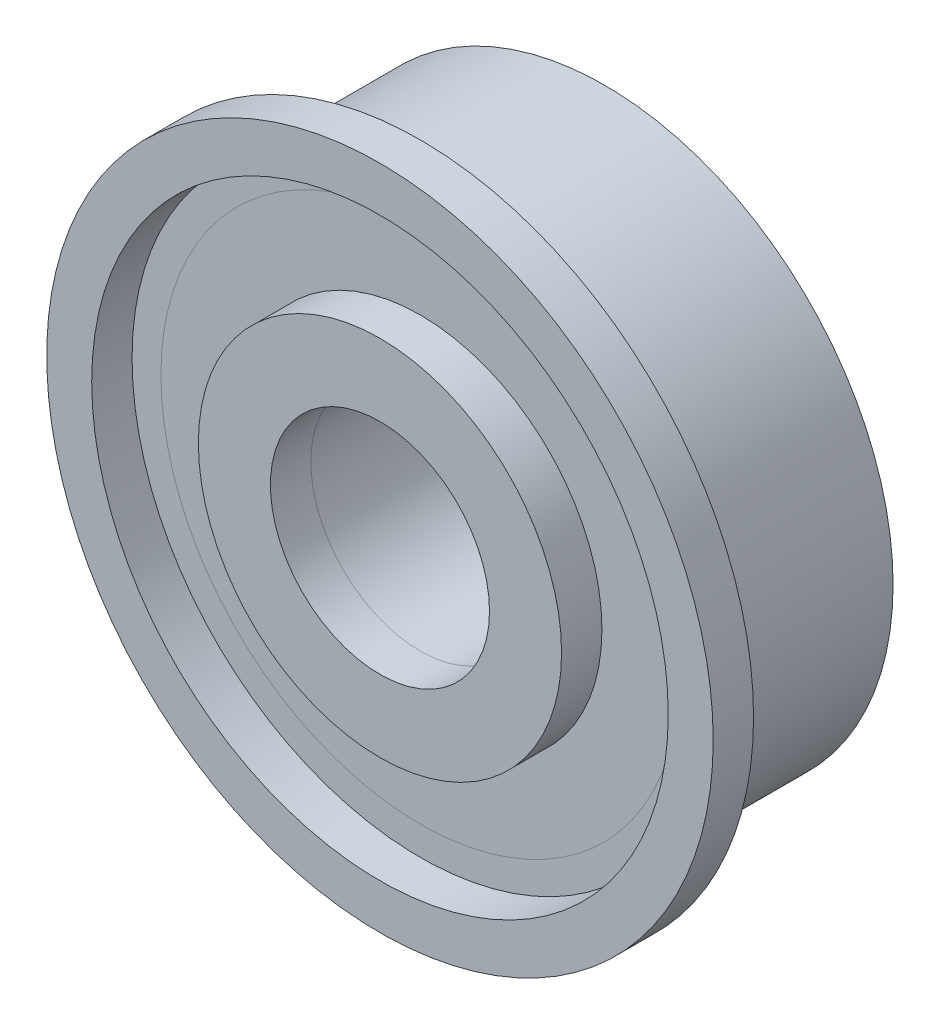
ISO-10303-21;
HEADER;
FILE_DESCRIPTION(('STEP AP214'),'2;1');
FILE_NAME('part.step','',(''),(''),'','','');
FILE_SCHEMA(('AUTOMOTIVE_DESIGN { 1 0 10303 214 1 1 1 1 }'));
ENDSEC;
DATA;
#1=APPLICATION_CONTEXT('core data for automotive mechanical design processes');
#2=APPLICATION_PROTOCOL_DEFINITION('international standard','automotive_design',2000,#1);
#3=PRODUCT_CONTEXT('',#1,'mechanical');
#4=PRODUCT('Part','Part','',(#3));
#5=PRODUCT_RELATED_PRODUCT_CATEGORY('part','',(#4));
#6=PRODUCT_DEFINITION_FORMATION('','',#4);
#7=PRODUCT_DEFINITION_CONTEXT('part definition',#1,'design');
#8=PRODUCT_DEFINITION('design','',#6,#7);
#9=PRODUCT_DEFINITION_SHAPE('','',#8);
#10=(LENGTH_UNIT() NAMED_UNIT(*) SI_UNIT(.MILLI.,.METRE.));
#11=(NAMED_UNIT(*) PLANE_ANGLE_UNIT() SI_UNIT($,.RADIAN.));
#12=(NAMED_UNIT(*) SI_UNIT($,.STERADIAN.) SOLID_ANGLE_UNIT());
#13=UNCERTAINTY_MEASURE_WITH_UNIT(LENGTH_MEASURE(1.E-05),#10,'distance_accuracy_value','');
#14=(GEOMETRIC_REPRESENTATION_CONTEXT(3) GLOBAL_UNCERTAINTY_ASSIGNED_CONTEXT((#13)) GLOBAL_UNIT_ASSIGNED_CONTEXT((#10,
#11,#12)) REPRESENTATION_CONTEXT('',''));
#15=CARTESIAN_POINT('',(0.,0.,0.));
#16=DIRECTION('',(0.,0.,1.));
#17=DIRECTION('',(1.,0.,0.));
#18=AXIS2_PLACEMENT_3D('',#15,#16,#17);
#19=CARTESIAN_POINT('',(0.,0.,12.8095454429505));
#20=DIRECTION('',(0.,0.,-1.));
#21=DIRECTION('',(-1.,0.,0.));
#22=AXIS2_PLACEMENT_3D('',#19,#20,#21);
#23=CYLINDRICAL_SURFACE('',#22,3.15);
#24=CARTESIAN_POINT('',(0.,0.,3.2));
#25=DIRECTION('',(0.,0.,1.));
#26=DIRECTION('',(1.,0.,0.));
#27=AXIS2_PLACEMENT_3D('',#24,#25,#26);
#28=CIRCLE('',#27,3.15);
#29=CARTESIAN_POINT('',(3.15,0.,3.2));
#30=VERTEX_POINT('',#29);
#31=EDGE_CURVE('E51',#30,#30,#28,.T.);
#32=ORIENTED_EDGE('',*,*,#31,.T.);
#33=EDGE_LOOP('',(#32));
#34=FACE_BOUND('',#33,.T.);
#35=CARTESIAN_POINT('',(0.,0.,3.9));
#36=DIRECTION('',(0.,0.,1.));
#37=DIRECTION('',(1.,0.,0.));
#38=AXIS2_PLACEMENT_3D('',#35,#36,#37);
#39=CIRCLE('',#38,3.15);
#40=CARTESIAN_POINT('',(3.15,0.,3.9));
#41=VERTEX_POINT('',#40);
#42=EDGE_CURVE('E11',#41,#41,#39,.T.);
#43=ORIENTED_EDGE('',*,*,#42,.F.);
#44=EDGE_LOOP('',(#43));
#45=FACE_BOUND('',#44,.T.);
#46=ADVANCED_FACE('F44',(#34,#45),#23,.T.);
#47=CARTESIAN_POINT('',(0.,0.,3.2));
#48=DIRECTION('',(0.,0.,1.));
#49=DIRECTION('',(1.,0.,0.));
#50=AXIS2_PLACEMENT_3D('',#47,#48,#49);
#51=PLANE('',#50);
#52=ORIENTED_EDGE('',*,*,#31,.F.);
#53=EDGE_LOOP('',(#52));
#54=FACE_BOUND('',#53,.T.);
#55=CARTESIAN_POINT('',(0.,0.,3.2));
#56=DIRECTION('',(0.,0.,1.));
#57=DIRECTION('',(1.,0.,0.));
#58=AXIS2_PLACEMENT_3D('',#55,#56,#57);
#59=CIRCLE('',#58,1.9);
#60=CARTESIAN_POINT('',(1.9,0.,3.2));
#61=VERTEX_POINT('',#60);
#62=EDGE_CURVE('E56',#61,#61,#59,.T.);
#63=ORIENTED_EDGE('',*,*,#62,.T.);
#64=EDGE_LOOP('',(#63));
#65=FACE_BOUND('',#64,.T.);
#66=ADVANCED_FACE('F72',(#54,#65),#51,.F.);
#67=CARTESIAN_POINT('',(0.,0.,12.8095454429505));
#68=DIRECTION('',(0.,0.,-1.));
#69=DIRECTION('',(-1.,0.,0.));
#70=AXIS2_PLACEMENT_3D('',#67,#68,#69);
#71=CYLINDRICAL_SURFACE('',#70,1.9);
#72=ORIENTED_EDGE('',*,*,#62,.F.);
#73=EDGE_LOOP('',(#72));
#74=FACE_BOUND('',#73,.T.);
#75=CARTESIAN_POINT('',(0.,0.,3.9));
#76=DIRECTION('',(0.,0.,1.));
#77=DIRECTION('',(1.,0.,0.));
#78=AXIS2_PLACEMENT_3D('',#75,#76,#77);
#79=CIRCLE('',#78,1.9);
#80=CARTESIAN_POINT('',(1.9,0.,3.9));
#81=VERTEX_POINT('',#80);
#82=EDGE_CURVE('E47',#81,#81,#79,.T.);
#83=ORIENTED_EDGE('',*,*,#82,.T.);
#84=EDGE_LOOP('',(#83));
#85=FACE_BOUND('',#84,.T.);
#86=ADVANCED_FACE('F64',(#74,#85),#71,.F.);
#87=CARTESIAN_POINT('',(0.,0.,3.9));
#88=DIRECTION('',(0.,0.,1.));
#89=DIRECTION('',(1.,0.,0.));
#90=AXIS2_PLACEMENT_3D('',#87,#88,#89);
#91=PLANE('',#90);
#92=ORIENTED_EDGE('',*,*,#82,.F.);
#93=EDGE_LOOP('',(#92));
#94=FACE_BOUND('',#93,.T.);
#95=ORIENTED_EDGE('',*,*,#42,.T.);
#96=EDGE_LOOP('',(#95));
#97=FACE_BOUND('',#96,.T.);
#98=ADVANCED_FACE('F66',(#94,#97),#91,.T.);
#99=CLOSED_SHELL('',(#46,#66,#86,#98));
#100=MANIFOLD_SOLID_BREP('B2',#99);
#101=CARTESIAN_POINT('',(0.,0.,3.9));
#102=DIRECTION('',(0.,0.,1.));
#103=DIRECTION('',(1.,0.,0.));
#104=AXIS2_PLACEMENT_3D('',#101,#102,#103);
#105=PLANE('',#104);
#106=CARTESIAN_POINT('',(0.,0.,3.9));
#107=DIRECTION('',(0.,0.,1.));
#108=DIRECTION('',(1.,0.,0.));
#109=AXIS2_PLACEMENT_3D('',#106,#107,#108);
#110=CIRCLE('',#109,5.78);
#111=CARTESIAN_POINT('',(5.78,0.,3.9));
#112=VERTEX_POINT('',#111);
#113=EDGE_CURVE('E43',#112,#112,#110,.T.);
#114=ORIENTED_EDGE('',*,*,#113,.T.);
#115=EDGE_LOOP('',(#114));
#116=FACE_BOUND('',#115,.T.);
#117=CARTESIAN_POINT('',(0.,0.,3.9));
#118=DIRECTION('',(0.,0.,1.));
#119=DIRECTION('',(1.,0.,0.));
#120=AXIS2_PLACEMENT_3D('',#117,#118,#119);
#121=CIRCLE('',#120,5.);
#122=CARTESIAN_POINT('',(5.,0.,3.9));
#123=VERTEX_POINT('',#122);
#124=EDGE_CURVE('E125',#123,#123,#121,.T.);
#125=ORIENTED_EDGE('',*,*,#124,.F.);
#126=EDGE_LOOP('',(#125));
#127=FACE_BOUND('',#126,.T.);
#128=ADVANCED_FACE('F114',(#116,#127),#105,.T.);
#129=CARTESIAN_POINT('',(0.,0.,3.2));
#130=DIRECTION('',(0.,0.,1.));
#131=DIRECTION('',(1.,0.,0.));
#132=AXIS2_PLACEMENT_3D('',#129,#130,#131);
#133=PLANE('',#132);
#134=CARTESIAN_POINT('',(0.,0.,3.2));
#135=DIRECTION('',(0.,0.,1.));
#136=DIRECTION('',(1.,0.,0.));
#137=AXIS2_PLACEMENT_3D('',#134,#135,#136);
#138=CIRCLE('',#137,5.78);
#139=CARTESIAN_POINT('',(5.78,0.,3.2));
#140=VERTEX_POINT('',#139);
#141=EDGE_CURVE('E118',#140,#140,#138,.T.);
#142=ORIENTED_EDGE('',*,*,#141,.F.);
#143=EDGE_LOOP('',(#142));
#144=FACE_BOUND('',#143,.T.);
#145=CARTESIAN_POINT('',(0.,0.,3.2));
#146=DIRECTION('',(0.,0.,1.));
#147=DIRECTION('',(1.,0.,0.));
#148=AXIS2_PLACEMENT_3D('',#145,#146,#147);
#149=CIRCLE('',#148,5.);
#150=CARTESIAN_POINT('',(5.,0.,3.2));
#151=VERTEX_POINT('',#150);
#152=EDGE_CURVE('E127',#151,#151,#149,.T.);
#153=ORIENTED_EDGE('',*,*,#152,.T.);
#154=EDGE_LOOP('',(#153));
#155=FACE_BOUND('',#154,.T.);
#156=ADVANCED_FACE('F137',(#144,#155),#133,.F.);
#157=CARTESIAN_POINT('',(0.,0.,3.9));
#158=DIRECTION('',(0.,0.,-1.));
#159=DIRECTION('',(-1.,0.,0.));
#160=AXIS2_PLACEMENT_3D('',#157,#158,#159);
#161=CYLINDRICAL_SURFACE('',#160,5.78);
#162=ORIENTED_EDGE('',*,*,#113,.F.);
#163=EDGE_LOOP('',(#162));
#164=FACE_BOUND('',#163,.T.);
#165=ORIENTED_EDGE('',*,*,#141,.T.);
#166=EDGE_LOOP('',(#165));
#167=FACE_BOUND('',#166,.T.);
#168=ADVANCED_FACE('F116',(#164,#167),#161,.T.);
#169=CARTESIAN_POINT('',(0.,0.,3.9));
#170=DIRECTION('',(0.,0.,-1.));
#171=DIRECTION('',(-1.,0.,0.));
#172=AXIS2_PLACEMENT_3D('',#169,#170,#171);
#173=CYLINDRICAL_SURFACE('',#172,5.);
#174=ORIENTED_EDGE('',*,*,#124,.T.);
#175=EDGE_LOOP('',(#174));
#176=FACE_BOUND('',#175,.T.);
#177=ORIENTED_EDGE('',*,*,#152,.F.);
#178=EDGE_LOOP('',(#177));
#179=FACE_BOUND('',#178,.T.);
#180=ADVANCED_FACE('F133',(#176,#179),#173,.F.);
#181=CLOSED_SHELL('',(#128,#156,#168,#180));
#182=MANIFOLD_SOLID_BREP('B6',#181);
#183=CARTESIAN_POINT('',(0.,0.,0.));
#184=DIRECTION('',(0.,0.,1.));
#185=DIRECTION('',(1.,0.,0.));
#186=AXIS2_PLACEMENT_3D('',#183,#184,#185);
#187=CYLINDRICAL_SURFACE('',#186,4.5);
#188=CARTESIAN_POINT('',(0.,0.,0.));
#189=DIRECTION('',(0.,0.,1.));
#190=DIRECTION('',(1.,0.,0.));
#191=AXIS2_PLACEMENT_3D('',#188,#189,#190);
#192=CIRCLE('',#191,4.5);
#193=CARTESIAN_POINT('',(4.5,0.,0.));
#194=VERTEX_POINT('',#193);
#195=EDGE_CURVE('E113',#194,#194,#192,.T.);
#196=ORIENTED_EDGE('',*,*,#195,.T.);
#197=EDGE_LOOP('',(#196));
#198=FACE_BOUND('',#197,.T.);
#199=CARTESIAN_POINT('',(0.,0.,3.2));
#200=DIRECTION('',(0.,0.,1.));
#201=DIRECTION('',(1.,0.,0.));
#202=AXIS2_PLACEMENT_3D('',#199,#200,#201);
#203=CIRCLE('',#202,4.5);
#204=CARTESIAN_POINT('',(4.5,0.,3.2));
#205=VERTEX_POINT('',#204);
#206=EDGE_CURVE('E187',#205,#205,#203,.T.);
#207=ORIENTED_EDGE('',*,*,#206,.F.);
#208=EDGE_LOOP('',(#207));
#209=FACE_BOUND('',#208,.T.);
#210=ADVANCED_FACE('F184',(#198,#209),#187,.T.);
#211=CARTESIAN_POINT('',(0.,0.,0.));
#212=DIRECTION('',(0.,0.,1.));
#213=DIRECTION('',(1.,0.,0.));
#214=AXIS2_PLACEMENT_3D('',#211,#212,#213);
#215=PLANE('',#214);
#216=CARTESIAN_POINT('',(0.,0.,0.));
#217=DIRECTION('',(0.,0.,1.));
#218=DIRECTION('',(1.,0.,0.));
#219=AXIS2_PLACEMENT_3D('',#216,#217,#218);
#220=CIRCLE('',#219,3.15);
#221=CARTESIAN_POINT('',(3.15,0.,0.));
#222=VERTEX_POINT('',#221);
#223=EDGE_CURVE('E194',#222,#222,#220,.T.);
#224=ORIENTED_EDGE('',*,*,#223,.T.);
#225=EDGE_LOOP('',(#224));
#226=FACE_BOUND('',#225,.T.);
#227=ORIENTED_EDGE('',*,*,#195,.F.);
#228=EDGE_LOOP('',(#227));
#229=FACE_BOUND('',#228,.T.);
#230=ADVANCED_FACE('F202',(#226,#229),#215,.F.);
#231=CARTESIAN_POINT('',(0.,0.,3.2));
#232=DIRECTION('',(0.,0.,1.));
#233=DIRECTION('',(1.,0.,0.));
#234=AXIS2_PLACEMENT_3D('',#231,#232,#233);
#235=PLANE('',#234);
#236=CARTESIAN_POINT('',(0.,0.,3.2));
#237=DIRECTION('',(0.,0.,1.));
#238=DIRECTION('',(1.,0.,0.));
#239=AXIS2_PLACEMENT_3D('',#236,#237,#238);
#240=CIRCLE('',#239,3.15);
#241=CARTESIAN_POINT('',(3.15,0.,3.2));
#242=VERTEX_POINT('',#241);
#243=EDGE_CURVE('E196',#242,#242,#240,.T.);
#244=ORIENTED_EDGE('',*,*,#243,.F.);
#245=EDGE_LOOP('',(#244));
#246=FACE_BOUND('',#245,.T.);
#247=ORIENTED_EDGE('',*,*,#206,.T.);
#248=EDGE_LOOP('',(#247));
#249=FACE_BOUND('',#248,.T.);
#250=ADVANCED_FACE('F208',(#246,#249),#235,.T.);
#251=CARTESIAN_POINT('',(0.,0.,0.));
#252=DIRECTION('',(0.,0.,1.));
#253=DIRECTION('',(1.,0.,0.));
#254=AXIS2_PLACEMENT_3D('',#251,#252,#253);
#255=CYLINDRICAL_SURFACE('',#254,3.15);
#256=ORIENTED_EDGE('',*,*,#223,.F.);
#257=EDGE_LOOP('',(#256));
#258=FACE_BOUND('',#257,.T.);
#259=ORIENTED_EDGE('',*,*,#243,.T.);
#260=EDGE_LOOP('',(#259));
#261=FACE_BOUND('',#260,.T.);
#262=ADVANCED_FACE('F205',(#258,#261),#255,.F.);
#263=CLOSED_SHELL('',(#210,#230,#250,#262));
#264=MANIFOLD_SOLID_BREP('B38',#263);
#265=CARTESIAN_POINT('',(0.,0.,-14.142135623731));
#266=DIRECTION('',(0.,0.,1.));
#267=DIRECTION('',(1.,0.,0.));
#268=AXIS2_PLACEMENT_3D('',#265,#266,#267);
#269=CYLINDRICAL_SURFACE('',#268,5.);
#270=CARTESIAN_POINT('',(0.,0.,0.));
#271=DIRECTION('',(0.,0.,1.));
#272=DIRECTION('',(1.,0.,0.));
#273=AXIS2_PLACEMENT_3D('',#270,#271,#272);
#274=CIRCLE('',#273,5.);
#275=CARTESIAN_POINT('',(5.,0.,0.));
#276=VERTEX_POINT('',#275);
#277=EDGE_CURVE('E259',#276,#276,#274,.F.);
#278=ORIENTED_EDGE('',*,*,#277,.F.);
#279=EDGE_LOOP('',(#278));
#280=FACE_BOUND('',#279,.T.);
#281=CARTESIAN_POINT('',(0.,0.,3.2));
#282=DIRECTION('',(0.,0.,1.));
#283=DIRECTION('',(1.,0.,0.));
#284=AXIS2_PLACEMENT_3D('',#281,#282,#283);
#285=CIRCLE('',#284,5.);
#286=CARTESIAN_POINT('',(5.,0.,3.2));
#287=VERTEX_POINT('',#286);
#288=EDGE_CURVE('E263',#287,#287,#285,.T.);
#289=ORIENTED_EDGE('',*,*,#288,.F.);
#290=EDGE_LOOP('',(#289));
#291=FACE_BOUND('',#290,.T.);
#292=ADVANCED_FACE('F253',(#280,#291),#269,.T.);
#293=CARTESIAN_POINT('',(0.,0.,3.2));
#294=DIRECTION('',(0.,0.,1.));
#295=DIRECTION('',(1.,0.,0.));
#296=AXIS2_PLACEMENT_3D('',#293,#294,#295);
#297=PLANE('',#296);
#298=CARTESIAN_POINT('',(0.,0.,3.2));
#299=DIRECTION('',(0.,0.,1.));
#300=DIRECTION('',(1.,0.,0.));
#301=AXIS2_PLACEMENT_3D('',#298,#299,#300);
#302=CIRCLE('',#301,4.5);
#303=CARTESIAN_POINT('',(4.5,0.,3.2));
#304=VERTEX_POINT('',#303);
#305=EDGE_CURVE('E268',#304,#304,#302,.T.);
#306=ORIENTED_EDGE('',*,*,#305,.F.);
#307=EDGE_LOOP('',(#306));
#308=FACE_BOUND('',#307,.T.);
#309=ORIENTED_EDGE('',*,*,#288,.T.);
#310=EDGE_LOOP('',(#309));
#311=FACE_BOUND('',#310,.T.);
#312=ADVANCED_FACE('F275',(#308,#311),#297,.T.);
#313=CARTESIAN_POINT('',(0.,0.,-14.142135623731));
#314=DIRECTION('',(0.,0.,1.));
#315=DIRECTION('',(1.,0.,0.));
#316=AXIS2_PLACEMENT_3D('',#313,#314,#315);
#317=CYLINDRICAL_SURFACE('',#316,4.5);
#318=CARTESIAN_POINT('',(0.,0.,0.));
#319=DIRECTION('',(0.,0.,1.));
#320=DIRECTION('',(1.,0.,0.));
#321=AXIS2_PLACEMENT_3D('',#318,#319,#320);
#322=CIRCLE('',#321,4.5);
#323=CARTESIAN_POINT('',(4.5,0.,0.));
#324=VERTEX_POINT('',#323);
#325=EDGE_CURVE('E183',#324,#324,#322,.F.);
#326=ORIENTED_EDGE('',*,*,#325,.T.);
#327=EDGE_LOOP('',(#326));
#328=FACE_BOUND('',#327,.T.);
#329=ORIENTED_EDGE('',*,*,#305,.T.);
#330=EDGE_LOOP('',(#329));
#331=FACE_BOUND('',#330,.T.);
#332=ADVANCED_FACE('F273',(#328,#331),#317,.F.);
#333=CARTESIAN_POINT('',(0.,0.,0.));
#334=DIRECTION('',(0.,0.,1.));
#335=DIRECTION('',(1.,0.,0.));
#336=AXIS2_PLACEMENT_3D('',#333,#334,#335);
#337=PLANE('',#336);
#338=ORIENTED_EDGE('',*,*,#277,.T.);
#339=EDGE_LOOP('',(#338));
#340=FACE_BOUND('',#339,.T.);
#341=ORIENTED_EDGE('',*,*,#325,.F.);
#342=EDGE_LOOP('',(#341));
#343=FACE_BOUND('',#342,.T.);
#344=ADVANCED_FACE('F294',(#340,#343),#337,.F.);
#345=CLOSED_SHELL('',(#292,#312,#332,#344));
#346=MANIFOLD_SOLID_BREP('B108',#345);
#347=CARTESIAN_POINT('',(0.,0.,3.2));
#348=DIRECTION('',(0.,0.,1.));
#349=DIRECTION('',(1.,0.,0.));
#350=AXIS2_PLACEMENT_3D('',#347,#348,#349);
#351=PLANE('',#350);
#352=CARTESIAN_POINT('',(0.,0.,3.2));
#353=DIRECTION('',(0.,0.,1.));
#354=DIRECTION('',(1.,0.,0.));
#355=AXIS2_PLACEMENT_3D('',#352,#353,#354);
#356=CIRCLE('',#355,3.15);
#357=CARTESIAN_POINT('',(3.15,0.,3.2));
#358=VERTEX_POINT('',#357);
#359=EDGE_CURVE('E252',#358,#358,#356,.T.);
#360=ORIENTED_EDGE('',*,*,#359,.T.);
#361=EDGE_LOOP('',(#360));
#362=FACE_BOUND('',#361,.T.);
#363=CARTESIAN_POINT('',(0.,0.,3.2));
#364=DIRECTION('',(0.,0.,1.));
#365=DIRECTION('',(1.,0.,0.));
#366=AXIS2_PLACEMENT_3D('',#363,#364,#365);
#367=CIRCLE('',#366,1.9);
#368=CARTESIAN_POINT('',(1.9,0.,3.2));
#369=VERTEX_POINT('',#368);
#370=EDGE_CURVE('E326',#369,#369,#367,.T.);
#371=ORIENTED_EDGE('',*,*,#370,.F.);
#372=EDGE_LOOP('',(#371));
#373=FACE_BOUND('',#372,.T.);
#374=ADVANCED_FACE('F315',(#362,#373),#351,.T.);
#375=CARTESIAN_POINT('',(0.,0.,0.));
#376=DIRECTION('',(0.,0.,1.));
#377=DIRECTION('',(1.,0.,0.));
#378=AXIS2_PLACEMENT_3D('',#375,#376,#377);
#379=PLANE('',#378);
#380=CARTESIAN_POINT('',(0.,0.,0.));
#381=DIRECTION('',(0.,0.,1.));
#382=DIRECTION('',(1.,0.,0.));
#383=AXIS2_PLACEMENT_3D('',#380,#381,#382);
#384=CIRCLE('',#383,3.15);
#385=CARTESIAN_POINT('',(3.15,0.,0.));
#386=VERTEX_POINT('',#385);
#387=EDGE_CURVE('E319',#386,#386,#384,.T.);
#388=ORIENTED_EDGE('',*,*,#387,.F.);
#389=EDGE_LOOP('',(#388));
#390=FACE_BOUND('',#389,.T.);
#391=CARTESIAN_POINT('',(0.,0.,0.));
#392=DIRECTION('',(0.,0.,1.));
#393=DIRECTION('',(1.,0.,0.));
#394=AXIS2_PLACEMENT_3D('',#391,#392,#393);
#395=CIRCLE('',#394,1.9);
#396=CARTESIAN_POINT('',(1.9,0.,0.));
#397=VERTEX_POINT('',#396);
#398=EDGE_CURVE('E328',#397,#397,#395,.T.);
#399=ORIENTED_EDGE('',*,*,#398,.T.);
#400=EDGE_LOOP('',(#399));
#401=FACE_BOUND('',#400,.T.);
#402=ADVANCED_FACE('F338',(#390,#401),#379,.F.);
#403=CARTESIAN_POINT('',(0.,0.,3.2));
#404=DIRECTION('',(0.,0.,-1.));
#405=DIRECTION('',(-1.,0.,0.));
#406=AXIS2_PLACEMENT_3D('',#403,#404,#405);
#407=CYLINDRICAL_SURFACE('',#406,3.15);
#408=ORIENTED_EDGE('',*,*,#359,.F.);
#409=EDGE_LOOP('',(#408));
#410=FACE_BOUND('',#409,.T.);
#411=ORIENTED_EDGE('',*,*,#387,.T.);
#412=EDGE_LOOP('',(#411));
#413=FACE_BOUND('',#412,.T.);
#414=ADVANCED_FACE('F317',(#410,#413),#407,.T.);
#415=CARTESIAN_POINT('',(0.,0.,3.2));
#416=DIRECTION('',(0.,0.,-1.));
#417=DIRECTION('',(-1.,0.,0.));
#418=AXIS2_PLACEMENT_3D('',#415,#416,#417);
#419=CYLINDRICAL_SURFACE('',#418,1.9);
#420=ORIENTED_EDGE('',*,*,#370,.T.);
#421=EDGE_LOOP('',(#420));
#422=FACE_BOUND('',#421,.T.);
#423=ORIENTED_EDGE('',*,*,#398,.F.);
#424=EDGE_LOOP('',(#423));
#425=FACE_BOUND('',#424,.T.);
#426=ADVANCED_FACE('F334',(#422,#425),#419,.F.);
#427=CLOSED_SHELL('',(#374,#402,#414,#426));
#428=MANIFOLD_SOLID_BREP('B178',#427);
#429=ADVANCED_BREP_SHAPE_REPRESENTATION('',(#18,#100,#182,#264,#346,#428),#14);
#430=SHAPE_DEFINITION_REPRESENTATION(#9,#429);
ENDSEC;
END-ISO-10303-21;
